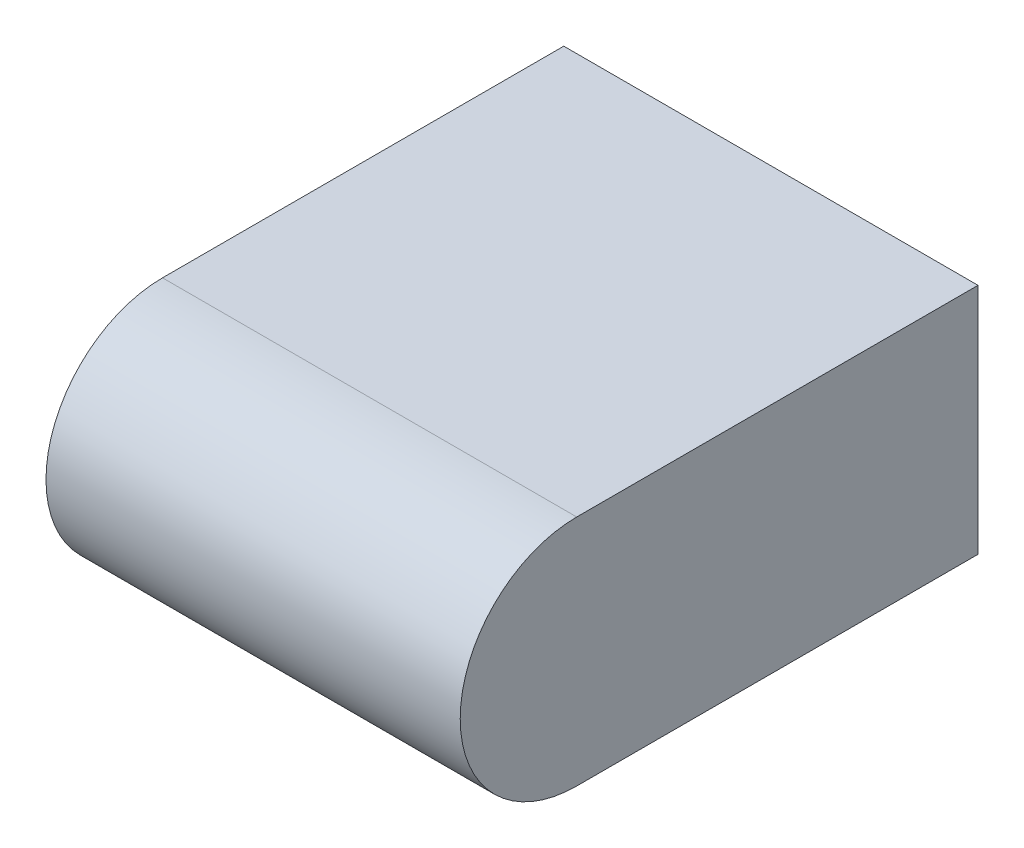
ISO-10303-21;
HEADER;
FILE_DESCRIPTION(('STEP AP214'),'2;1');
FILE_NAME('part.step','',(''),(''),'','','');
FILE_SCHEMA(('AUTOMOTIVE_DESIGN { 1 0 10303 214 1 1 1 1 }'));
ENDSEC;
DATA;
#1=APPLICATION_CONTEXT('core data for automotive mechanical design processes');
#2=APPLICATION_PROTOCOL_DEFINITION('international standard','automotive_design',2000,#1);
#3=PRODUCT_CONTEXT('',#1,'mechanical');
#4=PRODUCT('Part','Part','',(#3));
#5=PRODUCT_RELATED_PRODUCT_CATEGORY('part','',(#4));
#6=PRODUCT_DEFINITION_FORMATION('','',#4);
#7=PRODUCT_DEFINITION_CONTEXT('part definition',#1,'design');
#8=PRODUCT_DEFINITION('design','',#6,#7);
#9=PRODUCT_DEFINITION_SHAPE('','',#8);
#10=(LENGTH_UNIT() NAMED_UNIT(*) SI_UNIT(.MILLI.,.METRE.));
#11=(NAMED_UNIT(*) PLANE_ANGLE_UNIT() SI_UNIT($,.RADIAN.));
#12=(NAMED_UNIT(*) SI_UNIT($,.STERADIAN.) SOLID_ANGLE_UNIT());
#13=UNCERTAINTY_MEASURE_WITH_UNIT(LENGTH_MEASURE(1.E-05),#10,'distance_accuracy_value','');
#14=(GEOMETRIC_REPRESENTATION_CONTEXT(3) GLOBAL_UNCERTAINTY_ASSIGNED_CONTEXT((#13)) GLOBAL_UNIT_ASSIGNED_CONTEXT((#10,
#11,#12)) REPRESENTATION_CONTEXT('',''));
#15=CARTESIAN_POINT('',(0.,0.,0.));
#16=DIRECTION('',(0.,0.,1.));
#17=DIRECTION('',(1.,0.,0.));
#18=AXIS2_PLACEMENT_3D('',#15,#16,#17);
#19=CARTESIAN_POINT('',(-16.,9.,11.));
#20=DIRECTION('',(1.,0.,0.));
#21=DIRECTION('',(0.,0.,-1.));
#22=AXIS2_PLACEMENT_3D('',#19,#20,#21);
#23=CYLINDRICAL_SURFACE('',#22,9.);
#24=DIRECTION('',(1.,0.,0.));
#25=VECTOR('',#24,1.);
#26=CARTESIAN_POINT('',(0.,18.,11.));
#27=LINE('',#26,#25);
#28=CARTESIAN_POINT('',(-16.,18.,11.));
#29=VERTEX_POINT('',#28);
#30=CARTESIAN_POINT('',(16.,18.,11.));
#31=VERTEX_POINT('',#30);
#32=EDGE_CURVE('E78',#29,#31,#27,.T.);
#33=ORIENTED_EDGE('',*,*,#32,.F.);
#34=CARTESIAN_POINT('',(-16.,9.,11.));
#35=DIRECTION('',(1.,0.,0.));
#36=DIRECTION('',(0.,0.,-1.));
#37=AXIS2_PLACEMENT_3D('',#34,#35,#36);
#38=CIRCLE('',#37,9.);
#39=CARTESIAN_POINT('',(-16.,0.,11.));
#40=VERTEX_POINT('',#39);
#41=EDGE_CURVE('E43',#40,#29,#38,.F.);
#42=ORIENTED_EDGE('',*,*,#41,.F.);
#43=DIRECTION('',(-1.,0.,0.));
#44=VECTOR('',#43,1.);
#45=CARTESIAN_POINT('',(-16.,0.,11.));
#46=LINE('',#45,#44);
#47=CARTESIAN_POINT('',(16.,0.,11.));
#48=VERTEX_POINT('',#47);
#49=EDGE_CURVE('E96',#48,#40,#46,.T.);
#50=ORIENTED_EDGE('',*,*,#49,.F.);
#51=CARTESIAN_POINT('',(16.,9.,11.));
#52=DIRECTION('',(-1.,0.,0.));
#53=DIRECTION('',(0.,0.,1.));
#54=AXIS2_PLACEMENT_3D('',#51,#52,#53);
#55=CIRCLE('',#54,9.);
#56=EDGE_CURVE('E11',#31,#48,#55,.F.);
#57=ORIENTED_EDGE('',*,*,#56,.F.);
#58=EDGE_LOOP('',(#33,#42,#50,#57));
#59=FACE_BOUND('',#58,.T.);
#60=ADVANCED_FACE('F35',(#59),#23,.T.);
#61=CARTESIAN_POINT('',(16.,18.,20.));
#62=DIRECTION('',(-1.,0.,0.));
#63=DIRECTION('',(0.,0.,1.));
#64=AXIS2_PLACEMENT_3D('',#61,#62,#63);
#65=PLANE('',#64);
#66=DIRECTION('',(0.,0.,-1.));
#67=VECTOR('',#66,1.);
#68=CARTESIAN_POINT('',(16.,18.,20.));
#69=LINE('',#68,#67);
#70=CARTESIAN_POINT('',(16.,18.,-20.));
#71=VERTEX_POINT('',#70);
#72=EDGE_CURVE('E72',#31,#71,#69,.T.);
#73=ORIENTED_EDGE('',*,*,#72,.F.);
#74=ORIENTED_EDGE('',*,*,#56,.T.);
#75=DIRECTION('',(0.,0.,-1.));
#76=VECTOR('',#75,1.);
#77=CARTESIAN_POINT('',(16.,0.,20.));
#78=LINE('',#77,#76);
#79=CARTESIAN_POINT('',(16.,0.,-20.));
#80=VERTEX_POINT('',#79);
#81=EDGE_CURVE('E93',#48,#80,#78,.T.);
#82=ORIENTED_EDGE('',*,*,#81,.T.);
#83=DIRECTION('',(0.,-1.,0.));
#84=VECTOR('',#83,1.);
#85=CARTESIAN_POINT('',(16.,18.,-20.));
#86=LINE('',#85,#84);
#87=EDGE_CURVE('E85',#71,#80,#86,.T.);
#88=ORIENTED_EDGE('',*,*,#87,.F.);
#89=EDGE_LOOP('',(#73,#74,#82,#88));
#90=FACE_BOUND('',#89,.T.);
#91=ADVANCED_FACE('F91',(#90),#65,.F.);
#92=CARTESIAN_POINT('',(-16.,18.,-20.));
#93=DIRECTION('',(0.,0.,1.));
#94=DIRECTION('',(1.,0.,0.));
#95=AXIS2_PLACEMENT_3D('',#92,#93,#94);
#96=PLANE('',#95);
#97=DIRECTION('',(-1.,0.,0.));
#98=VECTOR('',#97,1.);
#99=CARTESIAN_POINT('',(-16.,0.,-20.));
#100=LINE('',#99,#98);
#101=CARTESIAN_POINT('',(-16.,0.,-20.));
#102=VERTEX_POINT('',#101);
#103=EDGE_CURVE('E108',#80,#102,#100,.T.);
#104=ORIENTED_EDGE('',*,*,#103,.T.);
#105=DIRECTION('',(0.,-1.,0.));
#106=VECTOR('',#105,1.);
#107=CARTESIAN_POINT('',(-16.,18.,-20.));
#108=LINE('',#107,#106);
#109=CARTESIAN_POINT('',(-16.,18.,-20.));
#110=VERTEX_POINT('',#109);
#111=EDGE_CURVE('E87',#110,#102,#108,.T.);
#112=ORIENTED_EDGE('',*,*,#111,.F.);
#113=DIRECTION('',(-1.,0.,0.));
#114=VECTOR('',#113,1.);
#115=CARTESIAN_POINT('',(-16.,18.,-20.));
#116=LINE('',#115,#114);
#117=EDGE_CURVE('E76',#71,#110,#116,.T.);
#118=ORIENTED_EDGE('',*,*,#117,.F.);
#119=ORIENTED_EDGE('',*,*,#87,.T.);
#120=EDGE_LOOP('',(#104,#112,#118,#119));
#121=FACE_BOUND('',#120,.T.);
#122=ADVANCED_FACE('F84',(#121),#96,.F.);
#123=CARTESIAN_POINT('',(-16.,18.,20.));
#124=DIRECTION('',(1.,0.,0.));
#125=DIRECTION('',(0.,0.,-1.));
#126=AXIS2_PLACEMENT_3D('',#123,#124,#125);
#127=PLANE('',#126);
#128=DIRECTION('',(0.,0.,1.));
#129=VECTOR('',#128,1.);
#130=CARTESIAN_POINT('',(-16.,0.,20.));
#131=LINE('',#130,#129);
#132=EDGE_CURVE('E80',#102,#40,#131,.T.);
#133=ORIENTED_EDGE('',*,*,#132,.T.);
#134=ORIENTED_EDGE('',*,*,#41,.T.);
#135=DIRECTION('',(0.,0.,1.));
#136=VECTOR('',#135,1.);
#137=CARTESIAN_POINT('',(-16.,18.,20.));
#138=LINE('',#137,#136);
#139=EDGE_CURVE('E89',#110,#29,#138,.T.);
#140=ORIENTED_EDGE('',*,*,#139,.F.);
#141=ORIENTED_EDGE('',*,*,#111,.T.);
#142=EDGE_LOOP('',(#133,#134,#140,#141));
#143=FACE_BOUND('',#142,.T.);
#144=ADVANCED_FACE('F103',(#143),#127,.F.);
#145=CARTESIAN_POINT('',(0.,18.,0.));
#146=DIRECTION('',(0.,-1.,0.));
#147=DIRECTION('',(0.,0.,-1.));
#148=AXIS2_PLACEMENT_3D('',#145,#146,#147);
#149=PLANE('',#148);
#150=ORIENTED_EDGE('',*,*,#139,.T.);
#151=ORIENTED_EDGE('',*,*,#32,.T.);
#152=ORIENTED_EDGE('',*,*,#72,.T.);
#153=ORIENTED_EDGE('',*,*,#117,.T.);
#154=EDGE_LOOP('',(#150,#151,#152,#153));
#155=FACE_BOUND('',#154,.T.);
#156=ADVANCED_FACE('F75',(#155),#149,.F.);
#157=CARTESIAN_POINT('',(0.,0.,0.));
#158=DIRECTION('',(0.,-1.,0.));
#159=DIRECTION('',(0.,0.,-1.));
#160=AXIS2_PLACEMENT_3D('',#157,#158,#159);
#161=PLANE('',#160);
#162=ORIENTED_EDGE('',*,*,#81,.F.);
#163=ORIENTED_EDGE('',*,*,#49,.T.);
#164=ORIENTED_EDGE('',*,*,#132,.F.);
#165=ORIENTED_EDGE('',*,*,#103,.F.);
#166=EDGE_LOOP('',(#162,#163,#164,#165));
#167=FACE_BOUND('',#166,.T.);
#168=ADVANCED_FACE('F110',(#167),#161,.T.);
#169=CLOSED_SHELL('',(#60,#91,#122,#144,#156,#168));
#170=MANIFOLD_SOLID_BREP('B2',#169);
#171=ADVANCED_BREP_SHAPE_REPRESENTATION('',(#18,#170),#14);
#172=SHAPE_DEFINITION_REPRESENTATION(#9,#171);
ENDSEC;
END-ISO-10303-21;
